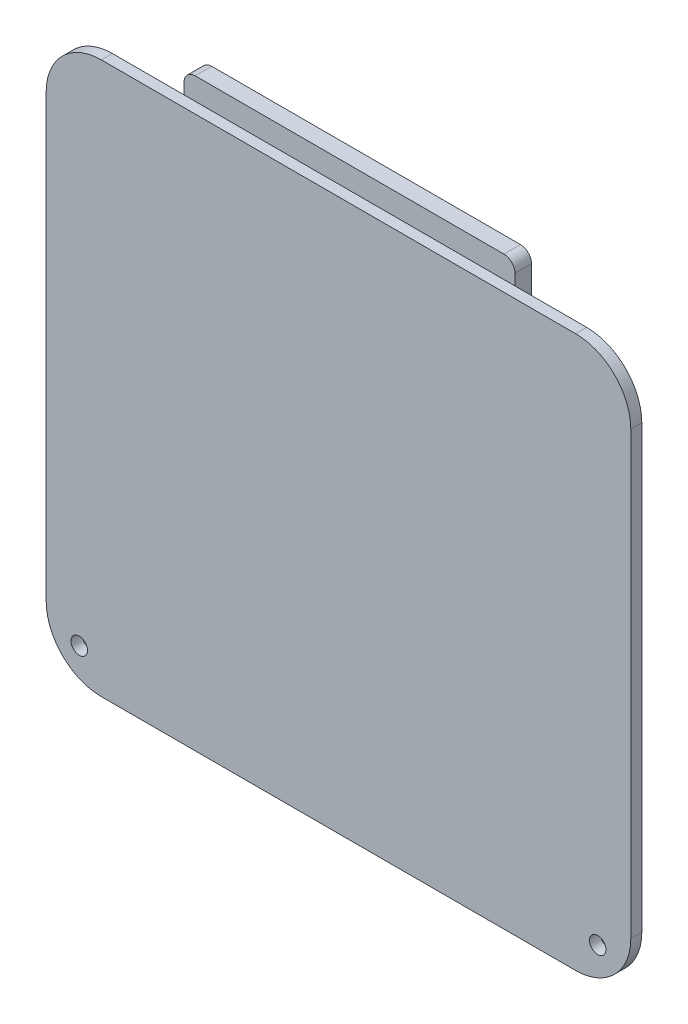
ISO-10303-21;
HEADER;
FILE_DESCRIPTION(('STEP AP214'),'2;1');
FILE_NAME('part.step','',(''),(''),'','','');
FILE_SCHEMA(('AUTOMOTIVE_DESIGN { 1 0 10303 214 1 1 1 1 }'));
ENDSEC;
DATA;
#1=APPLICATION_CONTEXT('core data for automotive mechanical design processes');
#2=APPLICATION_PROTOCOL_DEFINITION('international standard','automotive_design',2000,#1);
#3=PRODUCT_CONTEXT('',#1,'mechanical');
#4=PRODUCT('Part','Part','',(#3));
#5=PRODUCT_RELATED_PRODUCT_CATEGORY('part','',(#4));
#6=PRODUCT_DEFINITION_FORMATION('','',#4);
#7=PRODUCT_DEFINITION_CONTEXT('part definition',#1,'design');
#8=PRODUCT_DEFINITION('design','',#6,#7);
#9=PRODUCT_DEFINITION_SHAPE('','',#8);
#10=(LENGTH_UNIT() NAMED_UNIT(*) SI_UNIT(.MILLI.,.METRE.));
#11=(NAMED_UNIT(*) PLANE_ANGLE_UNIT() SI_UNIT($,.RADIAN.));
#12=(NAMED_UNIT(*) SI_UNIT($,.STERADIAN.) SOLID_ANGLE_UNIT());
#13=UNCERTAINTY_MEASURE_WITH_UNIT(LENGTH_MEASURE(1.E-05),#10,'distance_accuracy_value','');
#14=(GEOMETRIC_REPRESENTATION_CONTEXT(3) GLOBAL_UNCERTAINTY_ASSIGNED_CONTEXT((#13)) GLOBAL_UNIT_ASSIGNED_CONTEXT((#10,
#11,#12)) REPRESENTATION_CONTEXT('',''));
#15=CARTESIAN_POINT('',(0.,0.,0.));
#16=DIRECTION('',(0.,0.,1.));
#17=DIRECTION('',(1.,0.,0.));
#18=AXIS2_PLACEMENT_3D('',#15,#16,#17);
#19=CARTESIAN_POINT('',(-43.0000000000001,270.,-2.));
#20=DIRECTION('',(0.,0.,1.));
#21=DIRECTION('',(1.,0.,0.));
#22=AXIS2_PLACEMENT_3D('',#19,#20,#21);
#23=PLANE('',#22);
#24=CARTESIAN_POINT('',(-47.0000000000002,266.,-2.));
#25=DIRECTION('',(0.,0.,-1.));
#26=DIRECTION('',(1.,0.,0.));
#27=AXIS2_PLACEMENT_3D('',#24,#25,#26);
#28=CIRCLE('',#27,1.5);
#29=CARTESIAN_POINT('',(-45.5000000000002,266.,-2.));
#30=VERTEX_POINT('',#29);
#31=EDGE_CURVE('E188',#30,#30,#28,.T.);
#32=ORIENTED_EDGE('',*,*,#31,.F.);
#33=EDGE_LOOP('',(#32));
#34=FACE_BOUND('',#33,.T.);
#35=CARTESIAN_POINT('',(47.,266.,-2.));
#36=DIRECTION('',(0.,0.,-1.));
#37=DIRECTION('',(1.,0.,0.));
#38=AXIS2_PLACEMENT_3D('',#35,#36,#37);
#39=CIRCLE('',#38,1.5);
#40=CARTESIAN_POINT('',(48.5,266.,-2.));
#41=VERTEX_POINT('',#40);
#42=EDGE_CURVE('E241',#41,#41,#39,.T.);
#43=ORIENTED_EDGE('',*,*,#42,.F.);
#44=EDGE_LOOP('',(#43));
#45=FACE_BOUND('',#44,.T.);
#46=DIRECTION('',(-1.,0.,0.));
#47=VECTOR('',#46,1.);
#48=CARTESIAN_POINT('',(30.,348.25735931288,-2.));
#49=LINE('',#48,#47);
#50=CARTESIAN_POINT('',(-30.,348.25735931288,-2.));
#51=VERTEX_POINT('',#50);
#52=CARTESIAN_POINT('',(30.,348.25735931288,-2.));
#53=VERTEX_POINT('',#52);
#54=EDGE_CURVE('E250',#51,#53,#49,.F.);
#55=ORIENTED_EDGE('',*,*,#54,.T.);
#56=DIRECTION('',(0.,-1.,0.));
#57=VECTOR('',#56,1.);
#58=CARTESIAN_POINT('',(30.,352.5,-2.));
#59=LINE('',#58,#57);
#60=CARTESIAN_POINT('',(30.,360.,-2.));
#61=VERTEX_POINT('',#60);
#62=EDGE_CURVE('E226',#61,#53,#59,.T.);
#63=ORIENTED_EDGE('',*,*,#62,.F.);
#64=DIRECTION('',(-1.,0.,0.));
#65=VECTOR('',#64,1.);
#66=CARTESIAN_POINT('',(43.,360.,-2.));
#67=LINE('',#66,#65);
#68=CARTESIAN_POINT('',(43.,360.,-2.));
#69=VERTEX_POINT('',#68);
#70=EDGE_CURVE('E199',#69,#61,#67,.T.);
#71=ORIENTED_EDGE('',*,*,#70,.F.);
#72=CARTESIAN_POINT('',(43.,350.,-2.));
#73=DIRECTION('',(0.,0.,1.));
#74=DIRECTION('',(1.,0.,0.));
#75=AXIS2_PLACEMENT_3D('',#72,#73,#74);
#76=CIRCLE('',#75,10.);
#77=CARTESIAN_POINT('',(53.,350.,-2.));
#78=VERTEX_POINT('',#77);
#79=EDGE_CURVE('E195',#78,#69,#76,.T.);
#80=ORIENTED_EDGE('',*,*,#79,.F.);
#81=DIRECTION('',(0.,1.,0.));
#82=VECTOR('',#81,1.);
#83=CARTESIAN_POINT('',(53.,270.,-2.));
#84=LINE('',#83,#82);
#85=CARTESIAN_POINT('',(53.,270.,-2.));
#86=VERTEX_POINT('',#85);
#87=EDGE_CURVE('E192',#86,#78,#84,.T.);
#88=ORIENTED_EDGE('',*,*,#87,.F.);
#89=CARTESIAN_POINT('',(43.,270.,-2.));
#90=DIRECTION('',(0.,0.,1.));
#91=DIRECTION('',(1.,0.,0.));
#92=AXIS2_PLACEMENT_3D('',#89,#90,#91);
#93=CIRCLE('',#92,10.);
#94=CARTESIAN_POINT('',(43.,260.,-2.));
#95=VERTEX_POINT('',#94);
#96=EDGE_CURVE('E178',#95,#86,#93,.T.);
#97=ORIENTED_EDGE('',*,*,#96,.F.);
#98=DIRECTION('',(1.,0.,0.));
#99=VECTOR('',#98,1.);
#100=CARTESIAN_POINT('',(-43.0000000000001,260.,-2.));
#101=LINE('',#100,#99);
#102=CARTESIAN_POINT('',(-43.0000000000001,260.,-2.));
#103=VERTEX_POINT('',#102);
#104=EDGE_CURVE('E159',#103,#95,#101,.T.);
#105=ORIENTED_EDGE('',*,*,#104,.F.);
#106=CARTESIAN_POINT('',(-43.0000000000001,270.,-2.));
#107=DIRECTION('',(0.,0.,1.));
#108=DIRECTION('',(1.,0.,0.));
#109=AXIS2_PLACEMENT_3D('',#106,#107,#108);
#110=CIRCLE('',#109,10.);
#111=CARTESIAN_POINT('',(-53.0000000000001,270.,-2.));
#112=VERTEX_POINT('',#111);
#113=EDGE_CURVE('E174',#112,#103,#110,.T.);
#114=ORIENTED_EDGE('',*,*,#113,.F.);
#115=DIRECTION('',(0.,-1.,0.));
#116=VECTOR('',#115,1.);
#117=CARTESIAN_POINT('',(-53.0000000000001,350.,-2.));
#118=LINE('',#117,#116);
#119=CARTESIAN_POINT('',(-53.0000000000001,350.,-2.));
#120=VERTEX_POINT('',#119);
#121=EDGE_CURVE('E167',#120,#112,#118,.T.);
#122=ORIENTED_EDGE('',*,*,#121,.F.);
#123=CARTESIAN_POINT('',(-43.0000000000001,350.,-2.));
#124=DIRECTION('',(0.,0.,1.));
#125=DIRECTION('',(1.,0.,0.));
#126=AXIS2_PLACEMENT_3D('',#123,#124,#125);
#127=CIRCLE('',#126,10.);
#128=CARTESIAN_POINT('',(-43.0000000000001,360.,-2.));
#129=VERTEX_POINT('',#128);
#130=EDGE_CURVE('E202',#129,#120,#127,.T.);
#131=ORIENTED_EDGE('',*,*,#130,.F.);
#132=CARTESIAN_POINT('',(-30.,360.,-2.));
#133=VERTEX_POINT('',#132);
#134=EDGE_CURVE('E198',#133,#129,#67,.T.);
#135=ORIENTED_EDGE('',*,*,#134,.F.);
#136=DIRECTION('',(0.,1.,0.));
#137=VECTOR('',#136,1.);
#138=CARTESIAN_POINT('',(-30.,364.,-2.));
#139=LINE('',#138,#137);
#140=EDGE_CURVE('E302',#51,#133,#139,.T.);
#141=ORIENTED_EDGE('',*,*,#140,.F.);
#142=EDGE_LOOP('',(#55,#63,#71,#80,#88,#97,#105,#114,#122,#131,#135,#141));
#143=FACE_BOUND('',#142,.T.);
#144=ADVANCED_FACE('F34',(#34,#45,#143),#23,.F.);
#145=CARTESIAN_POINT('',(-43.0000000000001,270.,-2.));
#146=DIRECTION('',(0.,0.,1.));
#147=DIRECTION('',(1.,0.,0.));
#148=AXIS2_PLACEMENT_3D('',#145,#146,#147);
#149=CYLINDRICAL_SURFACE('',#148,10.);
#150=CARTESIAN_POINT('',(-43.0000000000001,270.,0.));
#151=DIRECTION('',(0.,0.,1.));
#152=DIRECTION('',(1.,0.,0.));
#153=AXIS2_PLACEMENT_3D('',#150,#151,#152);
#154=CIRCLE('',#153,10.);
#155=CARTESIAN_POINT('',(-53.0000000000001,270.,0.));
#156=VERTEX_POINT('',#155);
#157=CARTESIAN_POINT('',(-43.0000000000001,260.,0.));
#158=VERTEX_POINT('',#157);
#159=EDGE_CURVE('E207',#156,#158,#154,.T.);
#160=ORIENTED_EDGE('',*,*,#159,.F.);
#161=DIRECTION('',(0.,0.,1.));
#162=VECTOR('',#161,1.);
#163=CARTESIAN_POINT('',(-53.0000000000001,270.,-2.));
#164=LINE('',#163,#162);
#165=EDGE_CURVE('E181',#112,#156,#164,.T.);
#166=ORIENTED_EDGE('',*,*,#165,.F.);
#167=ORIENTED_EDGE('',*,*,#113,.T.);
#168=DIRECTION('',(0.,0.,1.));
#169=VECTOR('',#168,1.);
#170=CARTESIAN_POINT('',(-43.0000000000001,260.,-2.));
#171=LINE('',#170,#169);
#172=EDGE_CURVE('E156',#103,#158,#171,.T.);
#173=ORIENTED_EDGE('',*,*,#172,.T.);
#174=EDGE_LOOP('',(#160,#166,#167,#173));
#175=FACE_BOUND('',#174,.T.);
#176=ADVANCED_FACE('F180',(#175),#149,.T.);
#177=CARTESIAN_POINT('',(-53.0000000000001,350.,-2.));
#178=DIRECTION('',(-1.,0.,0.));
#179=DIRECTION('',(0.,-1.,0.));
#180=AXIS2_PLACEMENT_3D('',#177,#178,#179);
#181=PLANE('',#180);
#182=DIRECTION('',(0.,-1.,0.));
#183=VECTOR('',#182,1.);
#184=CARTESIAN_POINT('',(-53.0000000000001,350.,0.));
#185=LINE('',#184,#183);
#186=CARTESIAN_POINT('',(-53.0000000000001,350.,0.));
#187=VERTEX_POINT('',#186);
#188=EDGE_CURVE('E182',#187,#156,#185,.T.);
#189=ORIENTED_EDGE('',*,*,#188,.F.);
#190=DIRECTION('',(0.,0.,1.));
#191=VECTOR('',#190,1.);
#192=CARTESIAN_POINT('',(-53.0000000000001,350.,-2.));
#193=LINE('',#192,#191);
#194=EDGE_CURVE('E227',#120,#187,#193,.T.);
#195=ORIENTED_EDGE('',*,*,#194,.F.);
#196=ORIENTED_EDGE('',*,*,#121,.T.);
#197=ORIENTED_EDGE('',*,*,#165,.T.);
#198=EDGE_LOOP('',(#189,#195,#196,#197));
#199=FACE_BOUND('',#198,.T.);
#200=ADVANCED_FACE('F352',(#199),#181,.T.);
#201=CARTESIAN_POINT('',(-43.0000000000001,350.,-2.));
#202=DIRECTION('',(0.,0.,1.));
#203=DIRECTION('',(1.,0.,0.));
#204=AXIS2_PLACEMENT_3D('',#201,#202,#203);
#205=CYLINDRICAL_SURFACE('',#204,10.);
#206=CARTESIAN_POINT('',(-43.0000000000001,350.,0.));
#207=DIRECTION('',(0.,0.,1.));
#208=DIRECTION('',(1.,0.,0.));
#209=AXIS2_PLACEMENT_3D('',#206,#207,#208);
#210=CIRCLE('',#209,10.);
#211=CARTESIAN_POINT('',(-43.0000000000001,360.,0.));
#212=VERTEX_POINT('',#211);
#213=EDGE_CURVE('E185',#212,#187,#210,.T.);
#214=ORIENTED_EDGE('',*,*,#213,.F.);
#215=DIRECTION('',(0.,0.,1.));
#216=VECTOR('',#215,1.);
#217=CARTESIAN_POINT('',(-43.0000000000001,360.,-2.));
#218=LINE('',#217,#216);
#219=EDGE_CURVE('E229',#129,#212,#218,.T.);
#220=ORIENTED_EDGE('',*,*,#219,.F.);
#221=ORIENTED_EDGE('',*,*,#130,.T.);
#222=ORIENTED_EDGE('',*,*,#194,.T.);
#223=EDGE_LOOP('',(#214,#220,#221,#222));
#224=FACE_BOUND('',#223,.T.);
#225=ADVANCED_FACE('F365',(#224),#205,.T.);
#226=CARTESIAN_POINT('',(43.,360.,-2.));
#227=DIRECTION('',(0.,1.,0.));
#228=DIRECTION('',(0.,0.,1.));
#229=AXIS2_PLACEMENT_3D('',#226,#227,#228);
#230=PLANE('',#229);
#231=DIRECTION('',(-1.,0.,0.));
#232=VECTOR('',#231,1.);
#233=CARTESIAN_POINT('',(43.,360.,0.));
#234=LINE('',#233,#232);
#235=CARTESIAN_POINT('',(43.,360.,0.));
#236=VERTEX_POINT('',#235);
#237=EDGE_CURVE('E220',#236,#212,#234,.T.);
#238=ORIENTED_EDGE('',*,*,#237,.F.);
#239=DIRECTION('',(0.,0.,1.));
#240=VECTOR('',#239,1.);
#241=CARTESIAN_POINT('',(43.,360.,-2.));
#242=LINE('',#241,#240);
#243=EDGE_CURVE('E231',#69,#236,#242,.T.);
#244=ORIENTED_EDGE('',*,*,#243,.F.);
#245=ORIENTED_EDGE('',*,*,#70,.T.);
#246=EDGE_CURVE('E203',#61,#133,#67,.T.);
#247=ORIENTED_EDGE('',*,*,#246,.T.);
#248=ORIENTED_EDGE('',*,*,#134,.T.);
#249=ORIENTED_EDGE('',*,*,#219,.T.);
#250=EDGE_LOOP('',(#238,#244,#245,#247,#248,#249));
#251=FACE_BOUND('',#250,.T.);
#252=ADVANCED_FACE('F339',(#251),#230,.T.);
#253=CARTESIAN_POINT('',(43.,350.,-2.));
#254=DIRECTION('',(0.,0.,1.));
#255=DIRECTION('',(1.,0.,0.));
#256=AXIS2_PLACEMENT_3D('',#253,#254,#255);
#257=CYLINDRICAL_SURFACE('',#256,10.);
#258=CARTESIAN_POINT('',(43.,350.,0.));
#259=DIRECTION('',(0.,0.,1.));
#260=DIRECTION('',(1.,0.,0.));
#261=AXIS2_PLACEMENT_3D('',#258,#259,#260);
#262=CIRCLE('',#261,10.);
#263=CARTESIAN_POINT('',(53.,350.,0.));
#264=VERTEX_POINT('',#263);
#265=EDGE_CURVE('E217',#264,#236,#262,.T.);
#266=ORIENTED_EDGE('',*,*,#265,.F.);
#267=DIRECTION('',(0.,0.,1.));
#268=VECTOR('',#267,1.);
#269=CARTESIAN_POINT('',(53.,350.,-2.));
#270=LINE('',#269,#268);
#271=EDGE_CURVE('E233',#78,#264,#270,.T.);
#272=ORIENTED_EDGE('',*,*,#271,.F.);
#273=ORIENTED_EDGE('',*,*,#79,.T.);
#274=ORIENTED_EDGE('',*,*,#243,.T.);
#275=EDGE_LOOP('',(#266,#272,#273,#274));
#276=FACE_BOUND('',#275,.T.);
#277=ADVANCED_FACE('F372',(#276),#257,.T.);
#278=CARTESIAN_POINT('',(53.,270.,-2.));
#279=DIRECTION('',(1.,0.,0.));
#280=DIRECTION('',(0.,1.,0.));
#281=AXIS2_PLACEMENT_3D('',#278,#279,#280);
#282=PLANE('',#281);
#283=DIRECTION('',(0.,1.,0.));
#284=VECTOR('',#283,1.);
#285=CARTESIAN_POINT('',(53.,270.,0.));
#286=LINE('',#285,#284);
#287=CARTESIAN_POINT('',(53.,270.,0.));
#288=VERTEX_POINT('',#287);
#289=EDGE_CURVE('E214',#288,#264,#286,.T.);
#290=ORIENTED_EDGE('',*,*,#289,.F.);
#291=DIRECTION('',(0.,0.,1.));
#292=VECTOR('',#291,1.);
#293=CARTESIAN_POINT('',(53.,270.,-2.));
#294=LINE('',#293,#292);
#295=EDGE_CURVE('E235',#86,#288,#294,.T.);
#296=ORIENTED_EDGE('',*,*,#295,.F.);
#297=ORIENTED_EDGE('',*,*,#87,.T.);
#298=ORIENTED_EDGE('',*,*,#271,.T.);
#299=EDGE_LOOP('',(#290,#296,#297,#298));
#300=FACE_BOUND('',#299,.T.);
#301=ADVANCED_FACE('F375',(#300),#282,.T.);
#302=CARTESIAN_POINT('',(43.,270.,-2.));
#303=DIRECTION('',(0.,0.,1.));
#304=DIRECTION('',(1.,0.,0.));
#305=AXIS2_PLACEMENT_3D('',#302,#303,#304);
#306=CYLINDRICAL_SURFACE('',#305,10.);
#307=CARTESIAN_POINT('',(43.,270.,0.));
#308=DIRECTION('',(0.,0.,1.));
#309=DIRECTION('',(1.,0.,0.));
#310=AXIS2_PLACEMENT_3D('',#307,#308,#309);
#311=CIRCLE('',#310,10.);
#312=CARTESIAN_POINT('',(43.,260.,0.));
#313=VERTEX_POINT('',#312);
#314=EDGE_CURVE('E211',#313,#288,#311,.T.);
#315=ORIENTED_EDGE('',*,*,#314,.F.);
#316=DIRECTION('',(0.,0.,1.));
#317=VECTOR('',#316,1.);
#318=CARTESIAN_POINT('',(43.,260.,-2.));
#319=LINE('',#318,#317);
#320=EDGE_CURVE('E166',#95,#313,#319,.T.);
#321=ORIENTED_EDGE('',*,*,#320,.F.);
#322=ORIENTED_EDGE('',*,*,#96,.T.);
#323=ORIENTED_EDGE('',*,*,#295,.T.);
#324=EDGE_LOOP('',(#315,#321,#322,#323));
#325=FACE_BOUND('',#324,.T.);
#326=ADVANCED_FACE('F379',(#325),#306,.T.);
#327=CARTESIAN_POINT('',(-43.0000000000001,260.,-2.));
#328=DIRECTION('',(0.,-1.,0.));
#329=DIRECTION('',(0.,0.,-1.));
#330=AXIS2_PLACEMENT_3D('',#327,#328,#329);
#331=PLANE('',#330);
#332=DIRECTION('',(1.,0.,0.));
#333=VECTOR('',#332,1.);
#334=CARTESIAN_POINT('',(-43.0000000000001,260.,0.));
#335=LINE('',#334,#333);
#336=EDGE_CURVE('E161',#158,#313,#335,.T.);
#337=ORIENTED_EDGE('',*,*,#336,.F.);
#338=ORIENTED_EDGE('',*,*,#172,.F.);
#339=ORIENTED_EDGE('',*,*,#104,.T.);
#340=ORIENTED_EDGE('',*,*,#320,.T.);
#341=EDGE_LOOP('',(#337,#338,#339,#340));
#342=FACE_BOUND('',#341,.T.);
#343=ADVANCED_FACE('F158',(#342),#331,.T.);
#344=CARTESIAN_POINT('',(-43.0000000000001,270.,0.));
#345=DIRECTION('',(0.,0.,1.));
#346=DIRECTION('',(1.,0.,0.));
#347=AXIS2_PLACEMENT_3D('',#344,#345,#346);
#348=PLANE('',#347);
#349=CARTESIAN_POINT('',(47.,266.,0.));
#350=DIRECTION('',(0.,0.,1.));
#351=DIRECTION('',(1.,0.,0.));
#352=AXIS2_PLACEMENT_3D('',#349,#350,#351);
#353=CIRCLE('',#352,1.5);
#354=CARTESIAN_POINT('',(48.5,266.,0.));
#355=VERTEX_POINT('',#354);
#356=EDGE_CURVE('E209',#355,#355,#353,.T.);
#357=ORIENTED_EDGE('',*,*,#356,.F.);
#358=EDGE_LOOP('',(#357));
#359=FACE_BOUND('',#358,.T.);
#360=CARTESIAN_POINT('',(-47.0000000000002,266.,0.));
#361=DIRECTION('',(0.,0.,1.));
#362=DIRECTION('',(1.,0.,0.));
#363=AXIS2_PLACEMENT_3D('',#360,#361,#362);
#364=CIRCLE('',#363,1.5);
#365=CARTESIAN_POINT('',(-45.5000000000002,266.,0.));
#366=VERTEX_POINT('',#365);
#367=EDGE_CURVE('E238',#366,#366,#364,.T.);
#368=ORIENTED_EDGE('',*,*,#367,.F.);
#369=EDGE_LOOP('',(#368));
#370=FACE_BOUND('',#369,.T.);
#371=ORIENTED_EDGE('',*,*,#159,.T.);
#372=ORIENTED_EDGE('',*,*,#336,.T.);
#373=ORIENTED_EDGE('',*,*,#314,.T.);
#374=ORIENTED_EDGE('',*,*,#289,.T.);
#375=ORIENTED_EDGE('',*,*,#265,.T.);
#376=ORIENTED_EDGE('',*,*,#237,.T.);
#377=ORIENTED_EDGE('',*,*,#213,.T.);
#378=ORIENTED_EDGE('',*,*,#188,.T.);
#379=EDGE_LOOP('',(#371,#372,#373,#374,#375,#376,#377,#378));
#380=FACE_BOUND('',#379,.T.);
#381=ADVANCED_FACE('F359',(#359,#370,#380),#348,.T.);
#382=CARTESIAN_POINT('',(-47.0000000000002,266.,1.));
#383=DIRECTION('',(0.,0.,-1.));
#384=DIRECTION('',(-1.,0.,0.));
#385=AXIS2_PLACEMENT_3D('',#382,#383,#384);
#386=CYLINDRICAL_SURFACE('',#385,1.5);
#387=ORIENTED_EDGE('',*,*,#367,.T.);
#388=EDGE_LOOP('',(#387));
#389=FACE_BOUND('',#388,.T.);
#390=ORIENTED_EDGE('',*,*,#31,.T.);
#391=EDGE_LOOP('',(#390));
#392=FACE_BOUND('',#391,.T.);
#393=ADVANCED_FACE('F357',(#389,#392),#386,.F.);
#394=CARTESIAN_POINT('',(47.,266.,1.));
#395=DIRECTION('',(0.,0.,-1.));
#396=DIRECTION('',(-1.,0.,0.));
#397=AXIS2_PLACEMENT_3D('',#394,#395,#396);
#398=CYLINDRICAL_SURFACE('',#397,1.5);
#399=ORIENTED_EDGE('',*,*,#356,.T.);
#400=EDGE_LOOP('',(#399));
#401=FACE_BOUND('',#400,.T.);
#402=ORIENTED_EDGE('',*,*,#42,.T.);
#403=EDGE_LOOP('',(#402));
#404=FACE_BOUND('',#403,.T.);
#405=ADVANCED_FACE('F447',(#401,#404),#398,.F.);
#406=CARTESIAN_POINT('',(0.,0.,-2.));
#407=DIRECTION('',(0.,0.,1.));
#408=DIRECTION('',(1.,0.,0.));
#409=AXIS2_PLACEMENT_3D('',#406,#407,#408);
#410=PLANE('',#409);
#411=DIRECTION('',(1.,0.,0.));
#412=VECTOR('',#411,1.);
#413=CARTESIAN_POINT('',(30.,364.,-2.));
#414=LINE('',#413,#412);
#415=CARTESIAN_POINT('',(-28.,364.,-2.));
#416=VERTEX_POINT('',#415);
#417=CARTESIAN_POINT('',(28.,364.,-2.));
#418=VERTEX_POINT('',#417);
#419=EDGE_CURVE('E300',#416,#418,#414,.T.);
#420=ORIENTED_EDGE('',*,*,#419,.F.);
#421=CARTESIAN_POINT('',(-28.,362.,-2.));
#422=DIRECTION('',(0.,0.,1.));
#423=DIRECTION('',(1.,0.,0.));
#424=AXIS2_PLACEMENT_3D('',#421,#422,#423);
#425=CIRCLE('',#424,2.);
#426=CARTESIAN_POINT('',(-30.,362.,-2.));
#427=VERTEX_POINT('',#426);
#428=EDGE_CURVE('E276',#416,#427,#425,.T.);
#429=ORIENTED_EDGE('',*,*,#428,.T.);
#430=EDGE_CURVE('E298',#133,#427,#139,.T.);
#431=ORIENTED_EDGE('',*,*,#430,.F.);
#432=ORIENTED_EDGE('',*,*,#246,.F.);
#433=CARTESIAN_POINT('',(30.,362.,-2.));
#434=VERTEX_POINT('',#433);
#435=EDGE_CURVE('E307',#434,#61,#59,.T.);
#436=ORIENTED_EDGE('',*,*,#435,.F.);
#437=CARTESIAN_POINT('',(28.,362.,-2.));
#438=DIRECTION('',(0.,0.,1.));
#439=DIRECTION('',(1.,0.,0.));
#440=AXIS2_PLACEMENT_3D('',#437,#438,#439);
#441=CIRCLE('',#440,2.);
#442=EDGE_CURVE('E274',#434,#418,#441,.T.);
#443=ORIENTED_EDGE('',*,*,#442,.T.);
#444=EDGE_LOOP('',(#420,#429,#431,#432,#436,#443));
#445=FACE_BOUND('',#444,.T.);
#446=ADVANCED_FACE('F296',(#445),#410,.T.);
#447=CARTESIAN_POINT('',(-30.,364.,-5.));
#448=DIRECTION('',(1.,0.,0.));
#449=DIRECTION('',(0.,1.,0.));
#450=AXIS2_PLACEMENT_3D('',#447,#448,#449);
#451=PLANE('',#450);
#452=ORIENTED_EDGE('',*,*,#430,.T.);
#453=DIRECTION('',(0.,0.,1.));
#454=VECTOR('',#453,1.);
#455=CARTESIAN_POINT('',(-30.,362.,-5.));
#456=LINE('',#455,#454);
#457=CARTESIAN_POINT('',(-30.,362.,-5.));
#458=VERTEX_POINT('',#457);
#459=EDGE_CURVE('E57',#427,#458,#456,.F.);
#460=ORIENTED_EDGE('',*,*,#459,.T.);
#461=DIRECTION('',(0.,1.,0.));
#462=VECTOR('',#461,1.);
#463=CARTESIAN_POINT('',(-30.,364.,-5.));
#464=LINE('',#463,#462);
#465=CARTESIAN_POINT('',(-30.,353.742640687119,-5.));
#466=VERTEX_POINT('',#465);
#467=EDGE_CURVE('E283',#466,#458,#464,.T.);
#468=ORIENTED_EDGE('',*,*,#467,.F.);
#469=CARTESIAN_POINT('',(-30.,353.742640687119,-2.));
#470=DIRECTION('',(1.,0.,0.));
#471=DIRECTION('',(0.,1.,0.));
#472=AXIS2_PLACEMENT_3D('',#469,#470,#471);
#473=CIRCLE('',#472,3.);
#474=CARTESIAN_POINT('',(-30.,351.621320343559,-4.12132034355964));
#475=VERTEX_POINT('',#474);
#476=EDGE_CURVE('E259',#466,#475,#473,.F.);
#477=ORIENTED_EDGE('',*,*,#476,.T.);
#478=DIRECTION('',(0.,0.707106781186548,-0.707106781186547));
#479=VECTOR('',#478,1.);
#480=CARTESIAN_POINT('',(-30.,358.25,-10.75));
#481=LINE('',#480,#479);
#482=CARTESIAN_POINT('',(-30.,350.37867965644,-2.87867965644033));
#483=VERTEX_POINT('',#482);
#484=EDGE_CURVE('E244',#475,#483,#481,.F.);
#485=ORIENTED_EDGE('',*,*,#484,.T.);
#486=CARTESIAN_POINT('',(-30.,348.25735931288,-5.));
#487=DIRECTION('',(1.,0.,0.));
#488=DIRECTION('',(0.,1.,0.));
#489=AXIS2_PLACEMENT_3D('',#486,#487,#488);
#490=CIRCLE('',#489,3.);
#491=EDGE_CURVE('E266',#483,#51,#490,.T.);
#492=ORIENTED_EDGE('',*,*,#491,.T.);
#493=ORIENTED_EDGE('',*,*,#140,.T.);
#494=EDGE_LOOP('',(#452,#460,#468,#477,#485,#492,#493));
#495=FACE_BOUND('',#494,.T.);
#496=ADVANCED_FACE('F301',(#495),#451,.F.);
#497=CARTESIAN_POINT('',(30.,364.,-5.));
#498=DIRECTION('',(0.,-1.,0.));
#499=DIRECTION('',(0.,0.,-1.));
#500=AXIS2_PLACEMENT_3D('',#497,#498,#499);
#501=PLANE('',#500);
#502=DIRECTION('',(1.,0.,0.));
#503=VECTOR('',#502,1.);
#504=CARTESIAN_POINT('',(30.,364.,-5.));
#505=LINE('',#504,#503);
#506=CARTESIAN_POINT('',(-28.,364.,-5.));
#507=VERTEX_POINT('',#506);
#508=CARTESIAN_POINT('',(28.,364.,-5.));
#509=VERTEX_POINT('',#508);
#510=EDGE_CURVE('E282',#507,#509,#505,.T.);
#511=ORIENTED_EDGE('',*,*,#510,.F.);
#512=DIRECTION('',(0.,0.,1.));
#513=VECTOR('',#512,1.);
#514=CARTESIAN_POINT('',(-28.,364.,-5.));
#515=LINE('',#514,#513);
#516=EDGE_CURVE('E271',#507,#416,#515,.T.);
#517=ORIENTED_EDGE('',*,*,#516,.T.);
#518=ORIENTED_EDGE('',*,*,#419,.T.);
#519=DIRECTION('',(0.,0.,1.));
#520=VECTOR('',#519,1.);
#521=CARTESIAN_POINT('',(28.,364.,-5.));
#522=LINE('',#521,#520);
#523=EDGE_CURVE('E269',#418,#509,#522,.F.);
#524=ORIENTED_EDGE('',*,*,#523,.T.);
#525=EDGE_LOOP('',(#511,#517,#518,#524));
#526=FACE_BOUND('',#525,.T.);
#527=ADVANCED_FACE('F287',(#526),#501,.F.);
#528=CARTESIAN_POINT('',(30.,352.5,-5.));
#529=DIRECTION('',(-1.,0.,0.));
#530=DIRECTION('',(0.,0.,1.));
#531=AXIS2_PLACEMENT_3D('',#528,#529,#530);
#532=PLANE('',#531);
#533=DIRECTION('',(0.,-1.,0.));
#534=VECTOR('',#533,1.);
#535=CARTESIAN_POINT('',(30.,352.5,-5.));
#536=LINE('',#535,#534);
#537=CARTESIAN_POINT('',(30.,362.,-5.));
#538=VERTEX_POINT('',#537);
#539=CARTESIAN_POINT('',(30.,353.742640687119,-5.));
#540=VERTEX_POINT('',#539);
#541=EDGE_CURVE('E291',#538,#540,#536,.T.);
#542=ORIENTED_EDGE('',*,*,#541,.F.);
#543=DIRECTION('',(0.,0.,1.));
#544=VECTOR('',#543,1.);
#545=CARTESIAN_POINT('',(30.,362.,-5.));
#546=LINE('',#545,#544);
#547=EDGE_CURVE('E11',#538,#434,#546,.T.);
#548=ORIENTED_EDGE('',*,*,#547,.T.);
#549=ORIENTED_EDGE('',*,*,#435,.T.);
#550=ORIENTED_EDGE('',*,*,#62,.T.);
#551=CARTESIAN_POINT('',(30.,348.25735931288,-5.));
#552=DIRECTION('',(-1.,0.,0.));
#553=DIRECTION('',(0.,0.,1.));
#554=AXIS2_PLACEMENT_3D('',#551,#552,#553);
#555=CIRCLE('',#554,3.);
#556=CARTESIAN_POINT('',(30.,350.37867965644,-2.87867965644034));
#557=VERTEX_POINT('',#556);
#558=EDGE_CURVE('E264',#53,#557,#555,.T.);
#559=ORIENTED_EDGE('',*,*,#558,.T.);
#560=DIRECTION('',(0.,-0.707106781186548,0.707106781186547));
#561=VECTOR('',#560,1.);
#562=CARTESIAN_POINT('',(30.,352.5,-5.));
#563=LINE('',#562,#561);
#564=CARTESIAN_POINT('',(30.,351.621320343559,-4.12132034355965));
#565=VERTEX_POINT('',#564);
#566=EDGE_CURVE('E247',#557,#565,#563,.F.);
#567=ORIENTED_EDGE('',*,*,#566,.T.);
#568=CARTESIAN_POINT('',(30.,353.742640687119,-2.));
#569=DIRECTION('',(-1.,0.,0.));
#570=DIRECTION('',(0.,0.,1.));
#571=AXIS2_PLACEMENT_3D('',#568,#569,#570);
#572=CIRCLE('',#571,3.);
#573=EDGE_CURVE('E261',#565,#540,#572,.F.);
#574=ORIENTED_EDGE('',*,*,#573,.T.);
#575=EDGE_LOOP('',(#542,#548,#549,#550,#559,#567,#574));
#576=FACE_BOUND('',#575,.T.);
#577=ADVANCED_FACE('F318',(#576),#532,.F.);
#578=CARTESIAN_POINT('',(0.,0.,-5.));
#579=DIRECTION('',(0.,0.,1.));
#580=DIRECTION('',(1.,0.,0.));
#581=AXIS2_PLACEMENT_3D('',#578,#579,#580);
#582=PLANE('',#581);
#583=ORIENTED_EDGE('',*,*,#467,.T.);
#584=CARTESIAN_POINT('',(-28.,362.,-5.));
#585=DIRECTION('',(0.,0.,1.));
#586=DIRECTION('',(1.,0.,0.));
#587=AXIS2_PLACEMENT_3D('',#584,#585,#586);
#588=CIRCLE('',#587,2.);
#589=EDGE_CURVE('E42',#458,#507,#588,.F.);
#590=ORIENTED_EDGE('',*,*,#589,.T.);
#591=ORIENTED_EDGE('',*,*,#510,.T.);
#592=CARTESIAN_POINT('',(28.,362.,-5.));
#593=DIRECTION('',(0.,0.,1.));
#594=DIRECTION('',(1.,0.,0.));
#595=AXIS2_PLACEMENT_3D('',#592,#593,#594);
#596=CIRCLE('',#595,2.);
#597=EDGE_CURVE('E49',#509,#538,#596,.F.);
#598=ORIENTED_EDGE('',*,*,#597,.T.);
#599=ORIENTED_EDGE('',*,*,#541,.T.);
#600=DIRECTION('',(1.,0.,0.));
#601=VECTOR('',#600,1.);
#602=CARTESIAN_POINT('',(0.,353.742640687119,-5.));
#603=LINE('',#602,#601);
#604=EDGE_CURVE('E256',#540,#466,#603,.F.);
#605=ORIENTED_EDGE('',*,*,#604,.T.);
#606=EDGE_LOOP('',(#583,#590,#591,#598,#599,#605));
#607=FACE_BOUND('',#606,.T.);
#608=ADVANCED_FACE('F281',(#607),#582,.F.);
#609=CARTESIAN_POINT('',(-30.,352.5,-5.));
#610=DIRECTION('',(0.,-0.707106781186547,-0.707106781186548));
#611=DIRECTION('',(1.,0.,0.));
#612=AXIS2_PLACEMENT_3D('',#609,#610,#611);
#613=PLANE('',#612);
#614=ORIENTED_EDGE('',*,*,#566,.F.);
#615=DIRECTION('',(1.,0.,0.));
#616=VECTOR('',#615,1.);
#617=CARTESIAN_POINT('',(-30.,350.37867965644,-2.87867965644034));
#618=LINE('',#617,#616);
#619=EDGE_CURVE('E254',#557,#483,#618,.F.);
#620=ORIENTED_EDGE('',*,*,#619,.T.);
#621=ORIENTED_EDGE('',*,*,#484,.F.);
#622=DIRECTION('',(-1.,0.,0.));
#623=VECTOR('',#622,1.);
#624=CARTESIAN_POINT('',(-30.,351.621320343559,-4.12132034355965));
#625=LINE('',#624,#623);
#626=EDGE_CURVE('E252',#475,#565,#625,.F.);
#627=ORIENTED_EDGE('',*,*,#626,.T.);
#628=EDGE_LOOP('',(#614,#620,#621,#627));
#629=FACE_BOUND('',#628,.T.);
#630=ADVANCED_FACE('F326',(#629),#613,.T.);
#631=CARTESIAN_POINT('',(-43.0000000000001,348.25735931288,-5.));
#632=DIRECTION('',(1.,0.,0.));
#633=DIRECTION('',(0.,0.,-1.));
#634=AXIS2_PLACEMENT_3D('',#631,#632,#633);
#635=CYLINDRICAL_SURFACE('',#634,3.);
#636=ORIENTED_EDGE('',*,*,#491,.F.);
#637=ORIENTED_EDGE('',*,*,#619,.F.);
#638=ORIENTED_EDGE('',*,*,#558,.F.);
#639=ORIENTED_EDGE('',*,*,#54,.F.);
#640=EDGE_LOOP('',(#636,#637,#638,#639));
#641=FACE_BOUND('',#640,.T.);
#642=ADVANCED_FACE('F330',(#641),#635,.F.);
#643=CARTESIAN_POINT('',(0.,353.742640687119,-2.));
#644=DIRECTION('',(1.,0.,0.));
#645=DIRECTION('',(0.,0.,-1.));
#646=AXIS2_PLACEMENT_3D('',#643,#644,#645);
#647=CYLINDRICAL_SURFACE('',#646,3.);
#648=ORIENTED_EDGE('',*,*,#573,.F.);
#649=ORIENTED_EDGE('',*,*,#626,.F.);
#650=ORIENTED_EDGE('',*,*,#476,.F.);
#651=ORIENTED_EDGE('',*,*,#604,.F.);
#652=EDGE_LOOP('',(#648,#649,#650,#651));
#653=FACE_BOUND('',#652,.T.);
#654=ADVANCED_FACE('F322',(#653),#647,.T.);
#655=CARTESIAN_POINT('',(-28.,362.,-5.));
#656=DIRECTION('',(0.,0.,1.));
#657=DIRECTION('',(1.,0.,0.));
#658=AXIS2_PLACEMENT_3D('',#655,#656,#657);
#659=CYLINDRICAL_SURFACE('',#658,2.);
#660=ORIENTED_EDGE('',*,*,#589,.F.);
#661=ORIENTED_EDGE('',*,*,#459,.F.);
#662=ORIENTED_EDGE('',*,*,#428,.F.);
#663=ORIENTED_EDGE('',*,*,#516,.F.);
#664=EDGE_LOOP('',(#660,#661,#662,#663));
#665=FACE_BOUND('',#664,.T.);
#666=ADVANCED_FACE('F293',(#665),#659,.T.);
#667=CARTESIAN_POINT('',(28.,362.,-5.));
#668=DIRECTION('',(0.,0.,1.));
#669=DIRECTION('',(1.,0.,0.));
#670=AXIS2_PLACEMENT_3D('',#667,#668,#669);
#671=CYLINDRICAL_SURFACE('',#670,2.);
#672=ORIENTED_EDGE('',*,*,#597,.F.);
#673=ORIENTED_EDGE('',*,*,#523,.F.);
#674=ORIENTED_EDGE('',*,*,#442,.F.);
#675=ORIENTED_EDGE('',*,*,#547,.F.);
#676=EDGE_LOOP('',(#672,#673,#674,#675));
#677=FACE_BOUND('',#676,.T.);
#678=ADVANCED_FACE('F36',(#677),#671,.T.);
#679=CLOSED_SHELL('',(#144,#176,#200,#225,#252,#277,#301,#326,#343,#381,#393,#405,#446,#496,
#527,#577,#608,#630,#642,#654,#666,#678));
#680=MANIFOLD_SOLID_BREP('B2',#679);
#681=ADVANCED_BREP_SHAPE_REPRESENTATION('',(#18,#680),#14);
#682=SHAPE_DEFINITION_REPRESENTATION(#9,#681);
ENDSEC;
END-ISO-10303-21;
